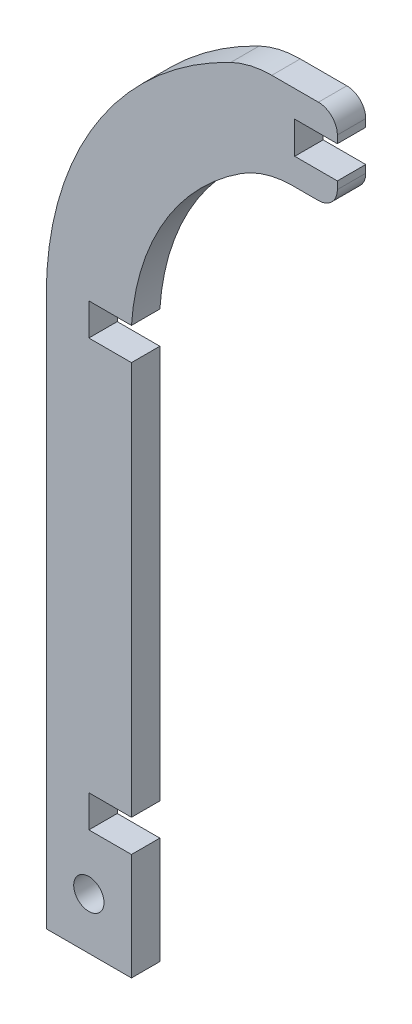
ISO-10303-21;
HEADER;
FILE_DESCRIPTION(('STEP AP214'),'2;1');
FILE_NAME('part.step','',(''),(''),'','','');
FILE_SCHEMA(('AUTOMOTIVE_DESIGN { 1 0 10303 214 1 1 1 1 }'));
ENDSEC;
DATA;
#1=APPLICATION_CONTEXT('core data for automotive mechanical design processes');
#2=APPLICATION_PROTOCOL_DEFINITION('international standard','automotive_design',2000,#1);
#3=PRODUCT_CONTEXT('',#1,'mechanical');
#4=PRODUCT('Part','Part','',(#3));
#5=PRODUCT_RELATED_PRODUCT_CATEGORY('part','',(#4));
#6=PRODUCT_DEFINITION_FORMATION('','',#4);
#7=PRODUCT_DEFINITION_CONTEXT('part definition',#1,'design');
#8=PRODUCT_DEFINITION('design','',#6,#7);
#9=PRODUCT_DEFINITION_SHAPE('','',#8);
#10=(LENGTH_UNIT() NAMED_UNIT(*) SI_UNIT(.MILLI.,.METRE.));
#11=(NAMED_UNIT(*) PLANE_ANGLE_UNIT() SI_UNIT($,.RADIAN.));
#12=(NAMED_UNIT(*) SI_UNIT($,.STERADIAN.) SOLID_ANGLE_UNIT());
#13=UNCERTAINTY_MEASURE_WITH_UNIT(LENGTH_MEASURE(1.E-05),#10,'distance_accuracy_value','');
#14=(GEOMETRIC_REPRESENTATION_CONTEXT(3) GLOBAL_UNCERTAINTY_ASSIGNED_CONTEXT((#13)) GLOBAL_UNIT_ASSIGNED_CONTEXT((#10,
#11,#12)) REPRESENTATION_CONTEXT('',''));
#15=CARTESIAN_POINT('',(0.,0.,0.));
#16=DIRECTION('',(0.,0.,1.));
#17=DIRECTION('',(1.,0.,0.));
#18=AXIS2_PLACEMENT_3D('',#15,#16,#17);
#19=CARTESIAN_POINT('',(-45.5,56.3,1.5));
#20=DIRECTION('',(0.,-1.,0.));
#21=DIRECTION('',(0.,0.,-1.));
#22=AXIS2_PLACEMENT_3D('',#19,#20,#21);
#23=PLANE('',#22);
#24=DIRECTION('',(-1.,0.,0.));
#25=VECTOR('',#24,1.);
#26=CARTESIAN_POINT('',(-45.5,56.3,-1.5));
#27=LINE('',#26,#25);
#28=CARTESIAN_POINT('',(-45.5,56.3,-1.5));
#29=VERTEX_POINT('',#28);
#30=CARTESIAN_POINT('',(-50.,56.3,-1.5));
#31=VERTEX_POINT('',#30);
#32=EDGE_CURVE('E217',#29,#31,#27,.T.);
#33=ORIENTED_EDGE('',*,*,#32,.T.);
#34=DIRECTION('',(0.,0.,-1.));
#35=VECTOR('',#34,1.);
#36=CARTESIAN_POINT('',(-50.,56.3,1.5));
#37=LINE('',#36,#35);
#38=CARTESIAN_POINT('',(-50.,56.3,1.5));
#39=VERTEX_POINT('',#38);
#40=EDGE_CURVE('E198',#39,#31,#37,.T.);
#41=ORIENTED_EDGE('',*,*,#40,.F.);
#42=DIRECTION('',(-1.,0.,0.));
#43=VECTOR('',#42,1.);
#44=CARTESIAN_POINT('',(-45.5,56.3,1.5));
#45=LINE('',#44,#43);
#46=CARTESIAN_POINT('',(-45.5,56.3,1.5));
#47=VERTEX_POINT('',#46);
#48=EDGE_CURVE('E204',#47,#39,#45,.T.);
#49=ORIENTED_EDGE('',*,*,#48,.F.);
#50=DIRECTION('',(0.,0.,-1.));
#51=VECTOR('',#50,1.);
#52=CARTESIAN_POINT('',(-45.5,56.3,1.5));
#53=LINE('',#52,#51);
#54=EDGE_CURVE('E288',#47,#29,#53,.T.);
#55=ORIENTED_EDGE('',*,*,#54,.T.);
#56=EDGE_LOOP('',(#33,#41,#49,#55));
#57=FACE_BOUND('',#56,.T.);
#58=ADVANCED_FACE('F39',(#57),#23,.F.);
#59=CARTESIAN_POINT('',(-50.,56.3,1.5));
#60=DIRECTION('',(-1.,0.,0.));
#61=DIRECTION('',(0.,0.,1.));
#62=AXIS2_PLACEMENT_3D('',#59,#60,#61);
#63=PLANE('',#62);
#64=DIRECTION('',(0.,1.,0.));
#65=VECTOR('',#64,1.);
#66=CARTESIAN_POINT('',(-50.,56.3,-1.5));
#67=LINE('',#66,#65);
#68=CARTESIAN_POINT('',(-50.,59.7,-1.5));
#69=VERTEX_POINT('',#68);
#70=EDGE_CURVE('E347',#31,#69,#67,.T.);
#71=ORIENTED_EDGE('',*,*,#70,.T.);
#72=DIRECTION('',(0.,0.,-1.));
#73=VECTOR('',#72,1.);
#74=CARTESIAN_POINT('',(-50.,59.7,1.5));
#75=LINE('',#74,#73);
#76=CARTESIAN_POINT('',(-50.,59.7,1.5));
#77=VERTEX_POINT('',#76);
#78=EDGE_CURVE('E201',#77,#69,#75,.T.);
#79=ORIENTED_EDGE('',*,*,#78,.F.);
#80=DIRECTION('',(0.,1.,0.));
#81=VECTOR('',#80,1.);
#82=CARTESIAN_POINT('',(-50.,56.3,1.5));
#83=LINE('',#82,#81);
#84=EDGE_CURVE('E194',#39,#77,#83,.T.);
#85=ORIENTED_EDGE('',*,*,#84,.F.);
#86=ORIENTED_EDGE('',*,*,#40,.T.);
#87=EDGE_LOOP('',(#71,#79,#85,#86));
#88=FACE_BOUND('',#87,.T.);
#89=ADVANCED_FACE('F196',(#88),#63,.F.);
#90=CARTESIAN_POINT('',(-50.,59.7,1.5));
#91=DIRECTION('',(0.,1.,0.));
#92=DIRECTION('',(0.,0.,1.));
#93=AXIS2_PLACEMENT_3D('',#90,#91,#92);
#94=PLANE('',#93);
#95=DIRECTION('',(1.,0.,0.));
#96=VECTOR('',#95,1.);
#97=CARTESIAN_POINT('',(-50.,59.7,-1.5));
#98=LINE('',#97,#96);
#99=CARTESIAN_POINT('',(-45.5,59.7,-1.5));
#100=VERTEX_POINT('',#99);
#101=EDGE_CURVE('E345',#69,#100,#98,.T.);
#102=ORIENTED_EDGE('',*,*,#101,.T.);
#103=DIRECTION('',(0.,0.,-1.));
#104=VECTOR('',#103,1.);
#105=CARTESIAN_POINT('',(-45.5,59.7,1.5));
#106=LINE('',#105,#104);
#107=CARTESIAN_POINT('',(-45.5,59.7,1.5));
#108=VERTEX_POINT('',#107);
#109=EDGE_CURVE('E223',#108,#100,#106,.T.);
#110=ORIENTED_EDGE('',*,*,#109,.F.);
#111=DIRECTION('',(1.,0.,0.));
#112=VECTOR('',#111,1.);
#113=CARTESIAN_POINT('',(-50.,59.7,1.5));
#114=LINE('',#113,#112);
#115=EDGE_CURVE('E203',#77,#108,#114,.T.);
#116=ORIENTED_EDGE('',*,*,#115,.F.);
#117=ORIENTED_EDGE('',*,*,#78,.T.);
#118=EDGE_LOOP('',(#102,#110,#116,#117));
#119=FACE_BOUND('',#118,.T.);
#120=ADVANCED_FACE('F410',(#119),#94,.F.);
#121=CARTESIAN_POINT('',(-20.08477011,58.,1.5));
#122=DIRECTION('',(0.,0.,-1.));
#123=DIRECTION('',(-1.,0.,0.));
#124=AXIS2_PLACEMENT_3D('',#121,#122,#123);
#125=CYLINDRICAL_SURFACE('',#124,25.4720221097884);
#126=CARTESIAN_POINT('',(-20.08477011,58.,-1.5));
#127=DIRECTION('',(0.,0.,-1.));
#128=DIRECTION('',(-1.,0.,0.));
#129=AXIS2_PLACEMENT_3D('',#126,#127,#128);
#130=CIRCLE('',#129,25.4720221097884);
#131=CARTESIAN_POINT('',(-33.8966145132646,79.4022630705624,-1.5));
#132=VERTEX_POINT('',#131);
#133=EDGE_CURVE('E340',#100,#132,#130,.T.);
#134=ORIENTED_EDGE('',*,*,#133,.T.);
#135=DIRECTION('',(0.,0.,-1.));
#136=VECTOR('',#135,1.);
#137=CARTESIAN_POINT('',(-33.8966145132646,79.4022630705624,1.5));
#138=LINE('',#137,#136);
#139=CARTESIAN_POINT('',(-33.8966145132646,79.4022630705624,1.5));
#140=VERTEX_POINT('',#139);
#141=EDGE_CURVE('E331',#140,#132,#138,.T.);
#142=ORIENTED_EDGE('',*,*,#141,.F.);
#143=CARTESIAN_POINT('',(-20.08477011,58.,1.5));
#144=DIRECTION('',(0.,0.,-1.));
#145=DIRECTION('',(-1.,0.,0.));
#146=AXIS2_PLACEMENT_3D('',#143,#144,#145);
#147=CIRCLE('',#146,25.4720221097884);
#148=EDGE_CURVE('E341',#108,#140,#147,.T.);
#149=ORIENTED_EDGE('',*,*,#148,.F.);
#150=ORIENTED_EDGE('',*,*,#109,.T.);
#151=EDGE_LOOP('',(#134,#142,#149,#150));
#152=FACE_BOUND('',#151,.T.);
#153=ADVANCED_FACE('F338',(#152),#125,.F.);
#154=CARTESIAN_POINT('',(-28.4742556821779,71.,1.5));
#155=DIRECTION('',(0.,0.,-1.));
#156=DIRECTION('',(-1.,0.,0.));
#157=AXIS2_PLACEMENT_3D('',#154,#155,#156);
#158=CYLINDRICAL_SURFACE('',#157,9.99999999999999);
#159=CARTESIAN_POINT('',(-28.4742556821779,71.,-1.5));
#160=DIRECTION('',(0.,0.,-1.));
#161=DIRECTION('',(-1.,0.,0.));
#162=AXIS2_PLACEMENT_3D('',#159,#160,#161);
#163=CIRCLE('',#162,9.99999999999999);
#164=CARTESIAN_POINT('',(-28.4742556821779,81.,-1.5));
#165=VERTEX_POINT('',#164);
#166=EDGE_CURVE('E259',#132,#165,#163,.T.);
#167=ORIENTED_EDGE('',*,*,#166,.T.);
#168=DIRECTION('',(0.,0.,-1.));
#169=VECTOR('',#168,1.);
#170=CARTESIAN_POINT('',(-28.4742556821779,81.,1.5));
#171=LINE('',#170,#169);
#172=CARTESIAN_POINT('',(-28.4742556821779,81.,1.5));
#173=VERTEX_POINT('',#172);
#174=EDGE_CURVE('E328',#173,#165,#171,.T.);
#175=ORIENTED_EDGE('',*,*,#174,.F.);
#176=CARTESIAN_POINT('',(-28.4742556821779,71.,1.5));
#177=DIRECTION('',(0.,0.,-1.));
#178=DIRECTION('',(-1.,0.,0.));
#179=AXIS2_PLACEMENT_3D('',#176,#177,#178);
#180=CIRCLE('',#179,9.99999999999999);
#181=EDGE_CURVE('E382',#140,#173,#180,.T.);
#182=ORIENTED_EDGE('',*,*,#181,.F.);
#183=ORIENTED_EDGE('',*,*,#141,.T.);
#184=EDGE_LOOP('',(#167,#175,#182,#183));
#185=FACE_BOUND('',#184,.T.);
#186=ADVANCED_FACE('F472',(#185),#158,.F.);
#187=CARTESIAN_POINT('',(-23.75,81.,1.5));
#188=DIRECTION('',(0.,1.,0.));
#189=DIRECTION('',(0.,0.,1.));
#190=AXIS2_PLACEMENT_3D('',#187,#188,#189);
#191=PLANE('',#190);
#192=DIRECTION('',(1.,0.,0.));
#193=VECTOR('',#192,1.);
#194=CARTESIAN_POINT('',(-23.75,81.,-1.5));
#195=LINE('',#194,#193);
#196=CARTESIAN_POINT('',(-25.75,81.,-1.5));
#197=VERTEX_POINT('',#196);
#198=EDGE_CURVE('E255',#165,#197,#195,.T.);
#199=ORIENTED_EDGE('',*,*,#198,.T.);
#200=DIRECTION('',(0.,0.,-1.));
#201=VECTOR('',#200,1.);
#202=CARTESIAN_POINT('',(-25.75,81.,1.5));
#203=LINE('',#202,#201);
#204=CARTESIAN_POINT('',(-25.75,81.,1.5));
#205=VERTEX_POINT('',#204);
#206=EDGE_CURVE('E11',#197,#205,#203,.F.);
#207=ORIENTED_EDGE('',*,*,#206,.T.);
#208=DIRECTION('',(1.,0.,0.));
#209=VECTOR('',#208,1.);
#210=CARTESIAN_POINT('',(-23.75,81.,1.5));
#211=LINE('',#210,#209);
#212=EDGE_CURVE('E380',#173,#205,#211,.T.);
#213=ORIENTED_EDGE('',*,*,#212,.F.);
#214=ORIENTED_EDGE('',*,*,#174,.T.);
#215=EDGE_LOOP('',(#199,#207,#213,#214));
#216=FACE_BOUND('',#215,.T.);
#217=ADVANCED_FACE('F473',(#216),#191,.F.);
#218=CARTESIAN_POINT('',(-23.75,83.8,1.5));
#219=DIRECTION('',(-1.,0.,0.));
#220=DIRECTION('',(0.,0.,1.));
#221=AXIS2_PLACEMENT_3D('',#218,#219,#220);
#222=PLANE('',#221);
#223=DIRECTION('',(0.,1.,0.));
#224=VECTOR('',#223,1.);
#225=CARTESIAN_POINT('',(-23.75,83.8,1.5));
#226=LINE('',#225,#224);
#227=CARTESIAN_POINT('',(-23.75,83.,1.5));
#228=VERTEX_POINT('',#227);
#229=CARTESIAN_POINT('',(-23.75,83.8,1.5));
#230=VERTEX_POINT('',#229);
#231=EDGE_CURVE('E246',#228,#230,#226,.T.);
#232=ORIENTED_EDGE('',*,*,#231,.F.);
#233=DIRECTION('',(0.,0.,-1.));
#234=VECTOR('',#233,1.);
#235=CARTESIAN_POINT('',(-23.75,83.,1.5));
#236=LINE('',#235,#234);
#237=CARTESIAN_POINT('',(-23.75,83.,-1.5));
#238=VERTEX_POINT('',#237);
#239=EDGE_CURVE('E47',#228,#238,#236,.T.);
#240=ORIENTED_EDGE('',*,*,#239,.T.);
#241=DIRECTION('',(0.,1.,0.));
#242=VECTOR('',#241,1.);
#243=CARTESIAN_POINT('',(-23.75,83.8,-1.5));
#244=LINE('',#243,#242);
#245=CARTESIAN_POINT('',(-23.75,83.8,-1.5));
#246=VERTEX_POINT('',#245);
#247=EDGE_CURVE('E244',#238,#246,#244,.T.);
#248=ORIENTED_EDGE('',*,*,#247,.T.);
#249=DIRECTION('',(0.,0.,-1.));
#250=VECTOR('',#249,1.);
#251=CARTESIAN_POINT('',(-23.75,83.8,1.5));
#252=LINE('',#251,#250);
#253=EDGE_CURVE('E326',#230,#246,#252,.T.);
#254=ORIENTED_EDGE('',*,*,#253,.F.);
#255=EDGE_LOOP('',(#232,#240,#248,#254));
#256=FACE_BOUND('',#255,.T.);
#257=ADVANCED_FACE('F242',(#256),#222,.F.);
#258=CARTESIAN_POINT('',(-28.25,83.8,1.5));
#259=DIRECTION('',(0.,-1.,0.));
#260=DIRECTION('',(0.,0.,-1.));
#261=AXIS2_PLACEMENT_3D('',#258,#259,#260);
#262=PLANE('',#261);
#263=DIRECTION('',(-1.,0.,0.));
#264=VECTOR('',#263,1.);
#265=CARTESIAN_POINT('',(-28.25,83.8,-1.5));
#266=LINE('',#265,#264);
#267=CARTESIAN_POINT('',(-28.25,83.8,-1.5));
#268=VERTEX_POINT('',#267);
#269=EDGE_CURVE('E254',#246,#268,#266,.T.);
#270=ORIENTED_EDGE('',*,*,#269,.T.);
#271=DIRECTION('',(0.,0.,-1.));
#272=VECTOR('',#271,1.);
#273=CARTESIAN_POINT('',(-28.25,83.8,1.5));
#274=LINE('',#273,#272);
#275=CARTESIAN_POINT('',(-28.25,83.8,1.5));
#276=VERTEX_POINT('',#275);
#277=EDGE_CURVE('E323',#276,#268,#274,.T.);
#278=ORIENTED_EDGE('',*,*,#277,.F.);
#279=DIRECTION('',(-1.,0.,0.));
#280=VECTOR('',#279,1.);
#281=CARTESIAN_POINT('',(-28.25,83.8,1.5));
#282=LINE('',#281,#280);
#283=EDGE_CURVE('E377',#230,#276,#282,.T.);
#284=ORIENTED_EDGE('',*,*,#283,.F.);
#285=ORIENTED_EDGE('',*,*,#253,.T.);
#286=EDGE_LOOP('',(#270,#278,#284,#285));
#287=FACE_BOUND('',#286,.T.);
#288=ADVANCED_FACE('F479',(#287),#262,.F.);
#289=CARTESIAN_POINT('',(-28.25,83.8,1.5));
#290=DIRECTION('',(-1.,0.,0.));
#291=DIRECTION('',(0.,0.,1.));
#292=AXIS2_PLACEMENT_3D('',#289,#290,#291);
#293=PLANE('',#292);
#294=DIRECTION('',(0.,1.,0.));
#295=VECTOR('',#294,1.);
#296=CARTESIAN_POINT('',(-28.25,83.8,-1.5));
#297=LINE('',#296,#295);
#298=CARTESIAN_POINT('',(-28.25,87.2,-1.5));
#299=VERTEX_POINT('',#298);
#300=EDGE_CURVE('E257',#268,#299,#297,.T.);
#301=ORIENTED_EDGE('',*,*,#300,.T.);
#302=DIRECTION('',(0.,0.,-1.));
#303=VECTOR('',#302,1.);
#304=CARTESIAN_POINT('',(-28.25,87.2,1.5));
#305=LINE('',#304,#303);
#306=CARTESIAN_POINT('',(-28.25,87.2,1.5));
#307=VERTEX_POINT('',#306);
#308=EDGE_CURVE('E320',#307,#299,#305,.T.);
#309=ORIENTED_EDGE('',*,*,#308,.F.);
#310=DIRECTION('',(0.,1.,0.));
#311=VECTOR('',#310,1.);
#312=CARTESIAN_POINT('',(-28.25,83.8,1.5));
#313=LINE('',#312,#311);
#314=EDGE_CURVE('E375',#276,#307,#313,.T.);
#315=ORIENTED_EDGE('',*,*,#314,.F.);
#316=ORIENTED_EDGE('',*,*,#277,.T.);
#317=EDGE_LOOP('',(#301,#309,#315,#316));
#318=FACE_BOUND('',#317,.T.);
#319=ADVANCED_FACE('F508',(#318),#293,.F.);
#320=CARTESIAN_POINT('',(-28.25,87.2,1.5));
#321=DIRECTION('',(0.,1.,0.));
#322=DIRECTION('',(0.,0.,1.));
#323=AXIS2_PLACEMENT_3D('',#320,#321,#322);
#324=PLANE('',#323);
#325=DIRECTION('',(1.,0.,0.));
#326=VECTOR('',#325,1.);
#327=CARTESIAN_POINT('',(-28.25,87.2,-1.5));
#328=LINE('',#327,#326);
#329=CARTESIAN_POINT('',(-23.75,87.2,-1.5));
#330=VERTEX_POINT('',#329);
#331=EDGE_CURVE('E264',#299,#330,#328,.T.);
#332=ORIENTED_EDGE('',*,*,#331,.T.);
#333=DIRECTION('',(0.,0.,-1.));
#334=VECTOR('',#333,1.);
#335=CARTESIAN_POINT('',(-23.75,87.2,1.5));
#336=LINE('',#335,#334);
#337=CARTESIAN_POINT('',(-23.75,87.2,1.5));
#338=VERTEX_POINT('',#337);
#339=EDGE_CURVE('E317',#338,#330,#336,.T.);
#340=ORIENTED_EDGE('',*,*,#339,.F.);
#341=DIRECTION('',(1.,0.,0.));
#342=VECTOR('',#341,1.);
#343=CARTESIAN_POINT('',(-28.25,87.2,1.5));
#344=LINE('',#343,#342);
#345=EDGE_CURVE('E373',#307,#338,#344,.T.);
#346=ORIENTED_EDGE('',*,*,#345,.F.);
#347=ORIENTED_EDGE('',*,*,#308,.T.);
#348=EDGE_LOOP('',(#332,#340,#346,#347));
#349=FACE_BOUND('',#348,.T.);
#350=ADVANCED_FACE('F517',(#349),#324,.F.);
#351=CARTESIAN_POINT('',(-23.75,87.2,1.5));
#352=DIRECTION('',(-1.,0.,0.));
#353=DIRECTION('',(0.,0.,1.));
#354=AXIS2_PLACEMENT_3D('',#351,#352,#353);
#355=PLANE('',#354);
#356=DIRECTION('',(0.,1.,0.));
#357=VECTOR('',#356,1.);
#358=CARTESIAN_POINT('',(-23.75,87.2,-1.5));
#359=LINE('',#358,#357);
#360=CARTESIAN_POINT('',(-23.75,88.,-1.5));
#361=VERTEX_POINT('',#360);
#362=EDGE_CURVE('E266',#330,#361,#359,.T.);
#363=ORIENTED_EDGE('',*,*,#362,.T.);
#364=DIRECTION('',(0.,0.,-1.));
#365=VECTOR('',#364,1.);
#366=CARTESIAN_POINT('',(-23.75,88.,1.5));
#367=LINE('',#366,#365);
#368=CARTESIAN_POINT('',(-23.75,88.,1.5));
#369=VERTEX_POINT('',#368);
#370=EDGE_CURVE('E234',#361,#369,#367,.F.);
#371=ORIENTED_EDGE('',*,*,#370,.T.);
#372=DIRECTION('',(0.,1.,0.));
#373=VECTOR('',#372,1.);
#374=CARTESIAN_POINT('',(-23.75,87.2,1.5));
#375=LINE('',#374,#373);
#376=EDGE_CURVE('E371',#338,#369,#375,.T.);
#377=ORIENTED_EDGE('',*,*,#376,.F.);
#378=ORIENTED_EDGE('',*,*,#339,.T.);
#379=EDGE_LOOP('',(#363,#371,#377,#378));
#380=FACE_BOUND('',#379,.T.);
#381=ADVANCED_FACE('F526',(#380),#355,.F.);
#382=CARTESIAN_POINT('',(-23.75,90.,1.5));
#383=DIRECTION('',(0.,-1.,0.));
#384=DIRECTION('',(0.,0.,-1.));
#385=AXIS2_PLACEMENT_3D('',#382,#383,#384);
#386=PLANE('',#385);
#387=DIRECTION('',(-1.,0.,0.));
#388=VECTOR('',#387,1.);
#389=CARTESIAN_POINT('',(-23.75,90.,1.5));
#390=LINE('',#389,#388);
#391=CARTESIAN_POINT('',(-25.75,90.,1.5));
#392=VERTEX_POINT('',#391);
#393=CARTESIAN_POINT('',(-30.6726618067236,90.,1.5));
#394=VERTEX_POINT('',#393);
#395=EDGE_CURVE('E369',#392,#394,#390,.T.);
#396=ORIENTED_EDGE('',*,*,#395,.F.);
#397=DIRECTION('',(0.,0.,-1.));
#398=VECTOR('',#397,1.);
#399=CARTESIAN_POINT('',(-25.75,90.,1.5));
#400=LINE('',#399,#398);
#401=CARTESIAN_POINT('',(-25.75,90.,-1.5));
#402=VERTEX_POINT('',#401);
#403=EDGE_CURVE('E218',#392,#402,#400,.T.);
#404=ORIENTED_EDGE('',*,*,#403,.T.);
#405=DIRECTION('',(-1.,0.,0.));
#406=VECTOR('',#405,1.);
#407=CARTESIAN_POINT('',(-23.75,90.,-1.5));
#408=LINE('',#407,#406);
#409=CARTESIAN_POINT('',(-30.6726618067236,90.,-1.5));
#410=VERTEX_POINT('',#409);
#411=EDGE_CURVE('E269',#402,#410,#408,.T.);
#412=ORIENTED_EDGE('',*,*,#411,.T.);
#413=DIRECTION('',(0.,0.,-1.));
#414=VECTOR('',#413,1.);
#415=CARTESIAN_POINT('',(-30.6726618067236,90.,1.5));
#416=LINE('',#415,#414);
#417=EDGE_CURVE('E314',#394,#410,#416,.T.);
#418=ORIENTED_EDGE('',*,*,#417,.F.);
#419=EDGE_LOOP('',(#396,#404,#412,#418));
#420=FACE_BOUND('',#419,.T.);
#421=ADVANCED_FACE('F428',(#420),#386,.F.);
#422=CARTESIAN_POINT('',(-30.6726618067236,80.,1.5));
#423=DIRECTION('',(0.,0.,-1.));
#424=DIRECTION('',(-1.,0.,0.));
#425=AXIS2_PLACEMENT_3D('',#422,#423,#424);
#426=CYLINDRICAL_SURFACE('',#425,10.);
#427=CARTESIAN_POINT('',(-30.6726618067236,80.,-1.5));
#428=DIRECTION('',(0.,0.,1.));
#429=DIRECTION('',(-1.,0.,0.));
#430=AXIS2_PLACEMENT_3D('',#427,#428,#429);
#431=CIRCLE('',#430,10.);
#432=CARTESIAN_POINT('',(-35.0092548858903,89.0107691384101,-1.5));
#433=VERTEX_POINT('',#432);
#434=EDGE_CURVE('E271',#410,#433,#431,.T.);
#435=ORIENTED_EDGE('',*,*,#434,.T.);
#436=DIRECTION('',(0.,0.,-1.));
#437=VECTOR('',#436,1.);
#438=CARTESIAN_POINT('',(-35.0092548858903,89.0107691384101,1.5));
#439=LINE('',#438,#437);
#440=CARTESIAN_POINT('',(-35.0092548858903,89.0107691384101,1.5));
#441=VERTEX_POINT('',#440);
#442=EDGE_CURVE('E311',#441,#433,#439,.T.);
#443=ORIENTED_EDGE('',*,*,#442,.F.);
#444=CARTESIAN_POINT('',(-30.6726618067236,80.,1.5));
#445=DIRECTION('',(0.,0.,1.));
#446=DIRECTION('',(-1.,0.,0.));
#447=AXIS2_PLACEMENT_3D('',#444,#445,#446);
#448=CIRCLE('',#447,10.);
#449=EDGE_CURVE('E367',#394,#441,#448,.T.);
#450=ORIENTED_EDGE('',*,*,#449,.F.);
#451=ORIENTED_EDGE('',*,*,#417,.T.);
#452=EDGE_LOOP('',(#435,#443,#450,#451));
#453=FACE_BOUND('',#452,.T.);
#454=ADVANCED_FACE('F433',(#453),#426,.T.);
#455=CARTESIAN_POINT('',(-20.08477011,58.,1.5));
#456=DIRECTION('',(0.,0.,-1.));
#457=DIRECTION('',(-1.,0.,0.));
#458=AXIS2_PLACEMENT_3D('',#455,#456,#457);
#459=CYLINDRICAL_SURFACE('',#458,34.41522989);
#460=CARTESIAN_POINT('',(-20.08477011,58.,-1.5));
#461=DIRECTION('',(0.,0.,1.));
#462=DIRECTION('',(-1.,0.,0.));
#463=AXIS2_PLACEMENT_3D('',#460,#461,#462);
#464=CIRCLE('',#463,34.41522989);
#465=CARTESIAN_POINT('',(-54.5,58.,-1.5));
#466=VERTEX_POINT('',#465);
#467=EDGE_CURVE('E273',#433,#466,#464,.T.);
#468=ORIENTED_EDGE('',*,*,#467,.T.);
#469=DIRECTION('',(0.,0.,-1.));
#470=VECTOR('',#469,1.);
#471=CARTESIAN_POINT('',(-54.5,58.,1.5));
#472=LINE('',#471,#470);
#473=CARTESIAN_POINT('',(-54.5,58.,1.5));
#474=VERTEX_POINT('',#473);
#475=EDGE_CURVE('E308',#474,#466,#472,.T.);
#476=ORIENTED_EDGE('',*,*,#475,.F.);
#477=CARTESIAN_POINT('',(-20.08477011,58.,1.5));
#478=DIRECTION('',(0.,0.,1.));
#479=DIRECTION('',(-1.,0.,0.));
#480=AXIS2_PLACEMENT_3D('',#477,#478,#479);
#481=CIRCLE('',#480,34.41522989);
#482=EDGE_CURVE('E365',#441,#474,#481,.T.);
#483=ORIENTED_EDGE('',*,*,#482,.F.);
#484=ORIENTED_EDGE('',*,*,#442,.T.);
#485=EDGE_LOOP('',(#468,#476,#483,#484));
#486=FACE_BOUND('',#485,.T.);
#487=ADVANCED_FACE('F439',(#486),#459,.T.);
#488=CARTESIAN_POINT('',(-54.5,0.,1.5));
#489=DIRECTION('',(1.,0.,0.));
#490=DIRECTION('',(0.,0.,-1.));
#491=AXIS2_PLACEMENT_3D('',#488,#489,#490);
#492=PLANE('',#491);
#493=DIRECTION('',(0.,-1.,0.));
#494=VECTOR('',#493,1.);
#495=CARTESIAN_POINT('',(-54.5,0.,-1.5));
#496=LINE('',#495,#494);
#497=CARTESIAN_POINT('',(-54.5,0.,-1.5));
#498=VERTEX_POINT('',#497);
#499=EDGE_CURVE('E275',#466,#498,#496,.T.);
#500=ORIENTED_EDGE('',*,*,#499,.T.);
#501=DIRECTION('',(0.,0.,-1.));
#502=VECTOR('',#501,1.);
#503=CARTESIAN_POINT('',(-54.5,0.,1.5));
#504=LINE('',#503,#502);
#505=CARTESIAN_POINT('',(-54.5,0.,1.5));
#506=VERTEX_POINT('',#505);
#507=EDGE_CURVE('E305',#506,#498,#504,.T.);
#508=ORIENTED_EDGE('',*,*,#507,.F.);
#509=DIRECTION('',(0.,-1.,0.));
#510=VECTOR('',#509,1.);
#511=CARTESIAN_POINT('',(-54.5,0.,1.5));
#512=LINE('',#511,#510);
#513=EDGE_CURVE('E363',#474,#506,#512,.T.);
#514=ORIENTED_EDGE('',*,*,#513,.F.);
#515=ORIENTED_EDGE('',*,*,#475,.T.);
#516=EDGE_LOOP('',(#500,#508,#514,#515));
#517=FACE_BOUND('',#516,.T.);
#518=ADVANCED_FACE('F443',(#517),#492,.F.);
#519=CARTESIAN_POINT('',(-54.5,0.,1.5));
#520=DIRECTION('',(0.,1.,0.));
#521=DIRECTION('',(-1.,0.,0.));
#522=AXIS2_PLACEMENT_3D('',#519,#520,#521);
#523=PLANE('',#522);
#524=DIRECTION('',(1.,0.,0.));
#525=VECTOR('',#524,1.);
#526=CARTESIAN_POINT('',(-54.5,0.,-1.5));
#527=LINE('',#526,#525);
#528=CARTESIAN_POINT('',(-45.5,0.,-1.5));
#529=VERTEX_POINT('',#528);
#530=EDGE_CURVE('E277',#498,#529,#527,.T.);
#531=ORIENTED_EDGE('',*,*,#530,.T.);
#532=DIRECTION('',(0.,0.,-1.));
#533=VECTOR('',#532,1.);
#534=CARTESIAN_POINT('',(-45.5,0.,1.5));
#535=LINE('',#534,#533);
#536=CARTESIAN_POINT('',(-45.5,0.,1.5));
#537=VERTEX_POINT('',#536);
#538=EDGE_CURVE('E302',#537,#529,#535,.T.);
#539=ORIENTED_EDGE('',*,*,#538,.F.);
#540=DIRECTION('',(1.,0.,0.));
#541=VECTOR('',#540,1.);
#542=CARTESIAN_POINT('',(-54.5,0.,1.5));
#543=LINE('',#542,#541);
#544=EDGE_CURVE('E361',#506,#537,#543,.T.);
#545=ORIENTED_EDGE('',*,*,#544,.F.);
#546=ORIENTED_EDGE('',*,*,#507,.T.);
#547=EDGE_LOOP('',(#531,#539,#545,#546));
#548=FACE_BOUND('',#547,.T.);
#549=ADVANCED_FACE('F448',(#548),#523,.F.);
#550=CARTESIAN_POINT('',(-45.5,0.,1.5));
#551=DIRECTION('',(-1.,0.,0.));
#552=DIRECTION('',(0.,0.,1.));
#553=AXIS2_PLACEMENT_3D('',#550,#551,#552);
#554=PLANE('',#553);
#555=DIRECTION('',(0.,1.,0.));
#556=VECTOR('',#555,1.);
#557=CARTESIAN_POINT('',(-45.5,0.,-1.5));
#558=LINE('',#557,#556);
#559=CARTESIAN_POINT('',(-45.5,11.3,-1.5));
#560=VERTEX_POINT('',#559);
#561=EDGE_CURVE('E279',#529,#560,#558,.T.);
#562=ORIENTED_EDGE('',*,*,#561,.T.);
#563=DIRECTION('',(0.,0.,-1.));
#564=VECTOR('',#563,1.);
#565=CARTESIAN_POINT('',(-45.5,11.3,1.5));
#566=LINE('',#565,#564);
#567=CARTESIAN_POINT('',(-45.5,11.3,1.5));
#568=VERTEX_POINT('',#567);
#569=EDGE_CURVE('E299',#568,#560,#566,.T.);
#570=ORIENTED_EDGE('',*,*,#569,.F.);
#571=DIRECTION('',(0.,1.,0.));
#572=VECTOR('',#571,1.);
#573=CARTESIAN_POINT('',(-45.5,0.,1.5));
#574=LINE('',#573,#572);
#575=EDGE_CURVE('E359',#537,#568,#574,.T.);
#576=ORIENTED_EDGE('',*,*,#575,.F.);
#577=ORIENTED_EDGE('',*,*,#538,.T.);
#578=EDGE_LOOP('',(#562,#570,#576,#577));
#579=FACE_BOUND('',#578,.T.);
#580=ADVANCED_FACE('F454',(#579),#554,.F.);
#581=CARTESIAN_POINT('',(-45.5,11.3,1.5));
#582=DIRECTION('',(0.,-1.,0.));
#583=DIRECTION('',(1.,0.,0.));
#584=AXIS2_PLACEMENT_3D('',#581,#582,#583);
#585=PLANE('',#584);
#586=DIRECTION('',(-1.,0.,0.));
#587=VECTOR('',#586,1.);
#588=CARTESIAN_POINT('',(-45.5,11.3,-1.5));
#589=LINE('',#588,#587);
#590=CARTESIAN_POINT('',(-50.,11.3,-1.5));
#591=VERTEX_POINT('',#590);
#592=EDGE_CURVE('E281',#560,#591,#589,.T.);
#593=ORIENTED_EDGE('',*,*,#592,.T.);
#594=DIRECTION('',(0.,0.,-1.));
#595=VECTOR('',#594,1.);
#596=CARTESIAN_POINT('',(-50.,11.3,1.5));
#597=LINE('',#596,#595);
#598=CARTESIAN_POINT('',(-50.,11.3,1.5));
#599=VERTEX_POINT('',#598);
#600=EDGE_CURVE('E296',#599,#591,#597,.T.);
#601=ORIENTED_EDGE('',*,*,#600,.F.);
#602=DIRECTION('',(-1.,0.,0.));
#603=VECTOR('',#602,1.);
#604=CARTESIAN_POINT('',(-45.5,11.3,1.5));
#605=LINE('',#604,#603);
#606=EDGE_CURVE('E357',#568,#599,#605,.T.);
#607=ORIENTED_EDGE('',*,*,#606,.F.);
#608=ORIENTED_EDGE('',*,*,#569,.T.);
#609=EDGE_LOOP('',(#593,#601,#607,#608));
#610=FACE_BOUND('',#609,.T.);
#611=ADVANCED_FACE('F458',(#610),#585,.F.);
#612=CARTESIAN_POINT('',(-50.,11.3,1.5));
#613=DIRECTION('',(-1.,0.,0.));
#614=DIRECTION('',(0.,0.,1.));
#615=AXIS2_PLACEMENT_3D('',#612,#613,#614);
#616=PLANE('',#615);
#617=DIRECTION('',(0.,1.,0.));
#618=VECTOR('',#617,1.);
#619=CARTESIAN_POINT('',(-50.,11.3,-1.5));
#620=LINE('',#619,#618);
#621=CARTESIAN_POINT('',(-50.,14.7,-1.5));
#622=VERTEX_POINT('',#621);
#623=EDGE_CURVE('E283',#591,#622,#620,.T.);
#624=ORIENTED_EDGE('',*,*,#623,.T.);
#625=DIRECTION('',(0.,0.,-1.));
#626=VECTOR('',#625,1.);
#627=CARTESIAN_POINT('',(-50.,14.7,1.5));
#628=LINE('',#627,#626);
#629=CARTESIAN_POINT('',(-50.,14.7,1.5));
#630=VERTEX_POINT('',#629);
#631=EDGE_CURVE('E293',#630,#622,#628,.T.);
#632=ORIENTED_EDGE('',*,*,#631,.F.);
#633=DIRECTION('',(0.,1.,0.));
#634=VECTOR('',#633,1.);
#635=CARTESIAN_POINT('',(-50.,11.3,1.5));
#636=LINE('',#635,#634);
#637=EDGE_CURVE('E355',#599,#630,#636,.T.);
#638=ORIENTED_EDGE('',*,*,#637,.F.);
#639=ORIENTED_EDGE('',*,*,#600,.T.);
#640=EDGE_LOOP('',(#624,#632,#638,#639));
#641=FACE_BOUND('',#640,.T.);
#642=ADVANCED_FACE('F463',(#641),#616,.F.);
#643=CARTESIAN_POINT('',(-50.,14.7,1.5));
#644=DIRECTION('',(0.,1.,0.));
#645=DIRECTION('',(0.,0.,1.));
#646=AXIS2_PLACEMENT_3D('',#643,#644,#645);
#647=PLANE('',#646);
#648=DIRECTION('',(1.,0.,0.));
#649=VECTOR('',#648,1.);
#650=CARTESIAN_POINT('',(-50.,14.7,-1.5));
#651=LINE('',#650,#649);
#652=CARTESIAN_POINT('',(-45.5,14.7,-1.5));
#653=VERTEX_POINT('',#652);
#654=EDGE_CURVE('E285',#622,#653,#651,.T.);
#655=ORIENTED_EDGE('',*,*,#654,.T.);
#656=DIRECTION('',(0.,0.,-1.));
#657=VECTOR('',#656,1.);
#658=CARTESIAN_POINT('',(-45.5,14.7,1.5));
#659=LINE('',#658,#657);
#660=CARTESIAN_POINT('',(-45.5,14.7,1.5));
#661=VERTEX_POINT('',#660);
#662=EDGE_CURVE('E290',#661,#653,#659,.T.);
#663=ORIENTED_EDGE('',*,*,#662,.F.);
#664=DIRECTION('',(1.,0.,0.));
#665=VECTOR('',#664,1.);
#666=CARTESIAN_POINT('',(-50.,14.7,1.5));
#667=LINE('',#666,#665);
#668=EDGE_CURVE('E353',#630,#661,#667,.T.);
#669=ORIENTED_EDGE('',*,*,#668,.F.);
#670=ORIENTED_EDGE('',*,*,#631,.T.);
#671=EDGE_LOOP('',(#655,#663,#669,#670));
#672=FACE_BOUND('',#671,.T.);
#673=ADVANCED_FACE('F401',(#672),#647,.F.);
#674=CARTESIAN_POINT('',(-45.5,14.7,1.5));
#675=DIRECTION('',(-1.,0.,0.));
#676=DIRECTION('',(0.,0.,1.));
#677=AXIS2_PLACEMENT_3D('',#674,#675,#676);
#678=PLANE('',#677);
#679=DIRECTION('',(0.,1.,0.));
#680=VECTOR('',#679,1.);
#681=CARTESIAN_POINT('',(-45.5,14.7,-1.5));
#682=LINE('',#681,#680);
#683=EDGE_CURVE('E214',#653,#29,#682,.T.);
#684=ORIENTED_EDGE('',*,*,#683,.T.);
#685=ORIENTED_EDGE('',*,*,#54,.F.);
#686=DIRECTION('',(0.,1.,0.));
#687=VECTOR('',#686,1.);
#688=CARTESIAN_POINT('',(-45.5,14.7,1.5));
#689=LINE('',#688,#687);
#690=EDGE_CURVE('E210',#661,#47,#689,.T.);
#691=ORIENTED_EDGE('',*,*,#690,.F.);
#692=ORIENTED_EDGE('',*,*,#662,.T.);
#693=EDGE_LOOP('',(#684,#685,#691,#692));
#694=FACE_BOUND('',#693,.T.);
#695=ADVANCED_FACE('F392',(#694),#678,.F.);
#696=CARTESIAN_POINT('',(-20.08477011,58.,1.5));
#697=DIRECTION('',(0.,0.,-1.));
#698=DIRECTION('',(-1.,0.,0.));
#699=AXIS2_PLACEMENT_3D('',#696,#697,#698);
#700=PLANE('',#699);
#701=CARTESIAN_POINT('',(-50.,5.4375,1.5));
#702=DIRECTION('',(0.,0.,1.));
#703=DIRECTION('',(1.,0.,0.));
#704=AXIS2_PLACEMENT_3D('',#701,#702,#703);
#705=CIRCLE('',#704,1.6);
#706=CARTESIAN_POINT('',(-48.4,5.4375,1.5));
#707=VERTEX_POINT('',#706);
#708=EDGE_CURVE('E229',#707,#707,#705,.T.);
#709=ORIENTED_EDGE('',*,*,#708,.F.);
#710=EDGE_LOOP('',(#709));
#711=FACE_BOUND('',#710,.T.);
#712=ORIENTED_EDGE('',*,*,#376,.T.);
#713=CARTESIAN_POINT('',(-25.75,88.,1.5));
#714=DIRECTION('',(0.,0.,-1.));
#715=DIRECTION('',(-1.,0.,0.));
#716=AXIS2_PLACEMENT_3D('',#713,#714,#715);
#717=CIRCLE('',#716,2.);
#718=EDGE_CURVE('E237',#369,#392,#717,.F.);
#719=ORIENTED_EDGE('',*,*,#718,.T.);
#720=ORIENTED_EDGE('',*,*,#395,.T.);
#721=ORIENTED_EDGE('',*,*,#449,.T.);
#722=ORIENTED_EDGE('',*,*,#482,.T.);
#723=ORIENTED_EDGE('',*,*,#513,.T.);
#724=ORIENTED_EDGE('',*,*,#544,.T.);
#725=ORIENTED_EDGE('',*,*,#575,.T.);
#726=ORIENTED_EDGE('',*,*,#606,.T.);
#727=ORIENTED_EDGE('',*,*,#637,.T.);
#728=ORIENTED_EDGE('',*,*,#668,.T.);
#729=ORIENTED_EDGE('',*,*,#690,.T.);
#730=ORIENTED_EDGE('',*,*,#48,.T.);
#731=ORIENTED_EDGE('',*,*,#84,.T.);
#732=ORIENTED_EDGE('',*,*,#115,.T.);
#733=ORIENTED_EDGE('',*,*,#148,.T.);
#734=ORIENTED_EDGE('',*,*,#181,.T.);
#735=ORIENTED_EDGE('',*,*,#212,.T.);
#736=CARTESIAN_POINT('',(-25.75,83.,1.5));
#737=DIRECTION('',(0.,0.,-1.));
#738=DIRECTION('',(-1.,0.,0.));
#739=AXIS2_PLACEMENT_3D('',#736,#737,#738);
#740=CIRCLE('',#739,2.);
#741=EDGE_CURVE('E54',#205,#228,#740,.F.);
#742=ORIENTED_EDGE('',*,*,#741,.T.);
#743=ORIENTED_EDGE('',*,*,#231,.T.);
#744=ORIENTED_EDGE('',*,*,#283,.T.);
#745=ORIENTED_EDGE('',*,*,#314,.T.);
#746=ORIENTED_EDGE('',*,*,#345,.T.);
#747=EDGE_LOOP('',(#712,#719,#720,#721,#722,#723,#724,#725,#726,#727,#728,#729,#730,#731,#732,
#733,#734,#735,#742,#743,#744,#745,#746));
#748=FACE_BOUND('',#747,.T.);
#749=ADVANCED_FACE('F208',(#711,#748),#700,.F.);
#750=CARTESIAN_POINT('',(-20.08477011,58.,-1.5));
#751=DIRECTION('',(0.,0.,-1.));
#752=DIRECTION('',(-1.,0.,0.));
#753=AXIS2_PLACEMENT_3D('',#750,#751,#752);
#754=PLANE('',#753);
#755=CARTESIAN_POINT('',(-50.,5.4375,-1.5));
#756=DIRECTION('',(0.,0.,-1.));
#757=DIRECTION('',(-1.,0.,0.));
#758=AXIS2_PLACEMENT_3D('',#755,#756,#757);
#759=CIRCLE('',#758,1.6);
#760=CARTESIAN_POINT('',(-51.6,5.4375,-1.5));
#761=VERTEX_POINT('',#760);
#762=EDGE_CURVE('E227',#761,#761,#759,.T.);
#763=ORIENTED_EDGE('',*,*,#762,.F.);
#764=EDGE_LOOP('',(#763));
#765=FACE_BOUND('',#764,.T.);
#766=ORIENTED_EDGE('',*,*,#411,.F.);
#767=CARTESIAN_POINT('',(-25.75,88.,-1.5));
#768=DIRECTION('',(0.,0.,-1.));
#769=DIRECTION('',(-1.,0.,0.));
#770=AXIS2_PLACEMENT_3D('',#767,#768,#769);
#771=CIRCLE('',#770,2.);
#772=EDGE_CURVE('E232',#402,#361,#771,.T.);
#773=ORIENTED_EDGE('',*,*,#772,.T.);
#774=ORIENTED_EDGE('',*,*,#362,.F.);
#775=ORIENTED_EDGE('',*,*,#331,.F.);
#776=ORIENTED_EDGE('',*,*,#300,.F.);
#777=ORIENTED_EDGE('',*,*,#269,.F.);
#778=ORIENTED_EDGE('',*,*,#247,.F.);
#779=CARTESIAN_POINT('',(-25.75,83.,-1.5));
#780=DIRECTION('',(0.,0.,-1.));
#781=DIRECTION('',(-1.,0.,0.));
#782=AXIS2_PLACEMENT_3D('',#779,#780,#781);
#783=CIRCLE('',#782,2.);
#784=EDGE_CURVE('E221',#238,#197,#783,.T.);
#785=ORIENTED_EDGE('',*,*,#784,.T.);
#786=ORIENTED_EDGE('',*,*,#198,.F.);
#787=ORIENTED_EDGE('',*,*,#166,.F.);
#788=ORIENTED_EDGE('',*,*,#133,.F.);
#789=ORIENTED_EDGE('',*,*,#101,.F.);
#790=ORIENTED_EDGE('',*,*,#70,.F.);
#791=ORIENTED_EDGE('',*,*,#32,.F.);
#792=ORIENTED_EDGE('',*,*,#683,.F.);
#793=ORIENTED_EDGE('',*,*,#654,.F.);
#794=ORIENTED_EDGE('',*,*,#623,.F.);
#795=ORIENTED_EDGE('',*,*,#592,.F.);
#796=ORIENTED_EDGE('',*,*,#561,.F.);
#797=ORIENTED_EDGE('',*,*,#530,.F.);
#798=ORIENTED_EDGE('',*,*,#499,.F.);
#799=ORIENTED_EDGE('',*,*,#467,.F.);
#800=ORIENTED_EDGE('',*,*,#434,.F.);
#801=EDGE_LOOP('',(#766,#773,#774,#775,#776,#777,#778,#785,#786,#787,#788,#789,#790,#791,#792,
#793,#794,#795,#796,#797,#798,#799,#800));
#802=FACE_BOUND('',#801,.T.);
#803=ADVANCED_FACE('F251',(#765,#802),#754,.T.);
#804=CARTESIAN_POINT('',(-50.,5.4375,1.5));
#805=DIRECTION('',(0.,0.,1.));
#806=DIRECTION('',(1.,0.,0.));
#807=AXIS2_PLACEMENT_3D('',#804,#805,#806);
#808=CYLINDRICAL_SURFACE('',#807,1.6);
#809=ORIENTED_EDGE('',*,*,#762,.T.);
#810=EDGE_LOOP('',(#809));
#811=FACE_BOUND('',#810,.T.);
#812=ORIENTED_EDGE('',*,*,#708,.T.);
#813=EDGE_LOOP('',(#812));
#814=FACE_BOUND('',#813,.T.);
#815=ADVANCED_FACE('F389',(#811,#814),#808,.F.);
#816=CARTESIAN_POINT('',(-25.75,88.,1.5));
#817=DIRECTION('',(0.,0.,-1.));
#818=DIRECTION('',(-1.,0.,0.));
#819=AXIS2_PLACEMENT_3D('',#816,#817,#818);
#820=CYLINDRICAL_SURFACE('',#819,2.);
#821=ORIENTED_EDGE('',*,*,#718,.F.);
#822=ORIENTED_EDGE('',*,*,#370,.F.);
#823=ORIENTED_EDGE('',*,*,#772,.F.);
#824=ORIENTED_EDGE('',*,*,#403,.F.);
#825=EDGE_LOOP('',(#821,#822,#823,#824));
#826=FACE_BOUND('',#825,.T.);
#827=ADVANCED_FACE('F413',(#826),#820,.T.);
#828=CARTESIAN_POINT('',(-25.75,83.,1.5));
#829=DIRECTION('',(0.,0.,-1.));
#830=DIRECTION('',(-1.,0.,0.));
#831=AXIS2_PLACEMENT_3D('',#828,#829,#830);
#832=CYLINDRICAL_SURFACE('',#831,2.);
#833=ORIENTED_EDGE('',*,*,#741,.F.);
#834=ORIENTED_EDGE('',*,*,#206,.F.);
#835=ORIENTED_EDGE('',*,*,#784,.F.);
#836=ORIENTED_EDGE('',*,*,#239,.F.);
#837=EDGE_LOOP('',(#833,#834,#835,#836));
#838=FACE_BOUND('',#837,.T.);
#839=ADVANCED_FACE('F41',(#838),#832,.T.);
#840=CLOSED_SHELL('',(#58,#89,#120,#153,#186,#217,#257,#288,#319,#350,#381,#421,#454,#487,#518,
#549,#580,#611,#642,#673,#695,#749,#803,#815,#827,#839));
#841=MANIFOLD_SOLID_BREP('B2',#840);
#842=ADVANCED_BREP_SHAPE_REPRESENTATION('',(#18,#841),#14);
#843=SHAPE_DEFINITION_REPRESENTATION(#9,#842);
ENDSEC;
END-ISO-10303-21;
